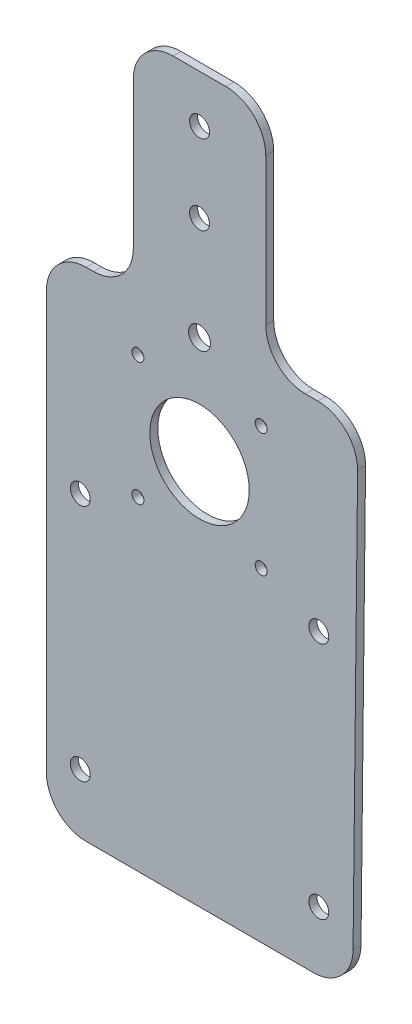
ISO-10303-21;
HEADER;
FILE_DESCRIPTION(('STEP AP214'),'2;1');
FILE_NAME('part.step','',(''),(''),'','','');
FILE_SCHEMA(('AUTOMOTIVE_DESIGN { 1 0 10303 214 1 1 1 1 }'));
ENDSEC;
DATA;
#1=APPLICATION_CONTEXT('core data for automotive mechanical design processes');
#2=APPLICATION_PROTOCOL_DEFINITION('international standard','automotive_design',2000,#1);
#3=PRODUCT_CONTEXT('',#1,'mechanical');
#4=PRODUCT('Part','Part','',(#3));
#5=PRODUCT_RELATED_PRODUCT_CATEGORY('part','',(#4));
#6=PRODUCT_DEFINITION_FORMATION('','',#4);
#7=PRODUCT_DEFINITION_CONTEXT('part definition',#1,'design');
#8=PRODUCT_DEFINITION('design','',#6,#7);
#9=PRODUCT_DEFINITION_SHAPE('','',#8);
#10=(LENGTH_UNIT() NAMED_UNIT(*) SI_UNIT(.MILLI.,.METRE.));
#11=(NAMED_UNIT(*) PLANE_ANGLE_UNIT() SI_UNIT($,.RADIAN.));
#12=(NAMED_UNIT(*) SI_UNIT($,.STERADIAN.) SOLID_ANGLE_UNIT());
#13=UNCERTAINTY_MEASURE_WITH_UNIT(LENGTH_MEASURE(1.E-05),#10,'distance_accuracy_value','');
#14=(GEOMETRIC_REPRESENTATION_CONTEXT(3) GLOBAL_UNCERTAINTY_ASSIGNED_CONTEXT((#13)) GLOBAL_UNIT_ASSIGNED_CONTEXT((#10,
#11,#12)) REPRESENTATION_CONTEXT('',''));
#15=CARTESIAN_POINT('',(0.,0.,0.));
#16=DIRECTION('',(0.,0.,1.));
#17=DIRECTION('',(1.,0.,0.));
#18=AXIS2_PLACEMENT_3D('',#15,#16,#17);
#19=CARTESIAN_POINT('',(0.,0.,2.));
#20=DIRECTION('',(0.,0.,-1.));
#21=DIRECTION('',(-1.,0.,0.));
#22=AXIS2_PLACEMENT_3D('',#19,#20,#21);
#23=PLANE('',#22);
#24=CARTESIAN_POINT('',(58.5,97.,2.));
#25=DIRECTION('',(0.,0.,1.));
#26=DIRECTION('',(1.,0.,0.));
#27=AXIS2_PLACEMENT_3D('',#24,#25,#26);
#28=CIRCLE('',#27,12.5);
#29=CARTESIAN_POINT('',(71.,97.,2.));
#30=VERTEX_POINT('',#29);
#31=EDGE_CURVE('E297',#30,#30,#28,.T.);
#32=ORIENTED_EDGE('',*,*,#31,.F.);
#33=EDGE_LOOP('',(#32));
#34=FACE_BOUND('',#33,.T.);
#35=CARTESIAN_POINT('',(43.,112.5,2.));
#36=DIRECTION('',(0.,0.,1.));
#37=DIRECTION('',(1.,0.,0.));
#38=AXIS2_PLACEMENT_3D('',#35,#36,#37);
#39=CIRCLE('',#38,1.5);
#40=CARTESIAN_POINT('',(44.5,112.5,2.));
#41=VERTEX_POINT('',#40);
#42=EDGE_CURVE('E294',#41,#41,#39,.T.);
#43=ORIENTED_EDGE('',*,*,#42,.F.);
#44=EDGE_LOOP('',(#43));
#45=FACE_BOUND('',#44,.T.);
#46=CARTESIAN_POINT('',(74.,112.5,2.));
#47=DIRECTION('',(0.,0.,1.));
#48=DIRECTION('',(1.,0.,0.));
#49=AXIS2_PLACEMENT_3D('',#46,#47,#48);
#50=CIRCLE('',#49,1.5);
#51=CARTESIAN_POINT('',(75.5,112.5,2.));
#52=VERTEX_POINT('',#51);
#53=EDGE_CURVE('E298',#52,#52,#50,.T.);
#54=ORIENTED_EDGE('',*,*,#53,.F.);
#55=EDGE_LOOP('',(#54));
#56=FACE_BOUND('',#55,.T.);
#57=CARTESIAN_POINT('',(74.,81.5,2.));
#58=DIRECTION('',(0.,0.,1.));
#59=DIRECTION('',(1.,0.,0.));
#60=AXIS2_PLACEMENT_3D('',#57,#58,#59);
#61=CIRCLE('',#60,1.5);
#62=CARTESIAN_POINT('',(75.5,81.5,2.));
#63=VERTEX_POINT('',#62);
#64=EDGE_CURVE('E301',#63,#63,#61,.T.);
#65=ORIENTED_EDGE('',*,*,#64,.F.);
#66=EDGE_LOOP('',(#65));
#67=FACE_BOUND('',#66,.T.);
#68=CARTESIAN_POINT('',(43.,81.5,2.));
#69=DIRECTION('',(0.,0.,1.));
#70=DIRECTION('',(1.,0.,0.));
#71=AXIS2_PLACEMENT_3D('',#68,#69,#70);
#72=CIRCLE('',#71,1.5);
#73=CARTESIAN_POINT('',(44.5,81.5,2.));
#74=VERTEX_POINT('',#73);
#75=EDGE_CURVE('E304',#74,#74,#72,.T.);
#76=ORIENTED_EDGE('',*,*,#75,.F.);
#77=EDGE_LOOP('',(#76));
#78=FACE_BOUND('',#77,.T.);
#79=CARTESIAN_POINT('',(28.5,75.,2.));
#80=DIRECTION('',(0.,0.,1.));
#81=DIRECTION('',(1.,0.,0.));
#82=AXIS2_PLACEMENT_3D('',#79,#80,#81);
#83=CIRCLE('',#82,2.5);
#84=CARTESIAN_POINT('',(31.,75.,2.));
#85=VERTEX_POINT('',#84);
#86=EDGE_CURVE('E307',#85,#85,#83,.T.);
#87=ORIENTED_EDGE('',*,*,#86,.F.);
#88=EDGE_LOOP('',(#87));
#89=FACE_BOUND('',#88,.T.);
#90=CARTESIAN_POINT('',(88.5,75.,2.));
#91=DIRECTION('',(0.,0.,1.));
#92=DIRECTION('',(1.,0.,0.));
#93=AXIS2_PLACEMENT_3D('',#90,#91,#92);
#94=CIRCLE('',#93,2.5);
#95=CARTESIAN_POINT('',(91.,75.,2.));
#96=VERTEX_POINT('',#95);
#97=EDGE_CURVE('E310',#96,#96,#94,.T.);
#98=ORIENTED_EDGE('',*,*,#97,.F.);
#99=EDGE_LOOP('',(#98));
#100=FACE_BOUND('',#99,.T.);
#101=CARTESIAN_POINT('',(88.5,15.,2.));
#102=DIRECTION('',(0.,0.,1.));
#103=DIRECTION('',(1.,0.,0.));
#104=AXIS2_PLACEMENT_3D('',#101,#102,#103);
#105=CIRCLE('',#104,2.50000000000001);
#106=CARTESIAN_POINT('',(91.,15.,2.));
#107=VERTEX_POINT('',#106);
#108=EDGE_CURVE('E313',#107,#107,#105,.T.);
#109=ORIENTED_EDGE('',*,*,#108,.F.);
#110=EDGE_LOOP('',(#109));
#111=FACE_BOUND('',#110,.T.);
#112=CARTESIAN_POINT('',(28.5,15.,2.));
#113=DIRECTION('',(0.,0.,1.));
#114=DIRECTION('',(1.,0.,0.));
#115=AXIS2_PLACEMENT_3D('',#112,#113,#114);
#116=CIRCLE('',#115,2.5);
#117=CARTESIAN_POINT('',(31.,15.,2.));
#118=VERTEX_POINT('',#117);
#119=EDGE_CURVE('E316',#118,#118,#116,.T.);
#120=ORIENTED_EDGE('',*,*,#119,.F.);
#121=EDGE_LOOP('',(#120));
#122=FACE_BOUND('',#121,.T.);
#123=CARTESIAN_POINT('',(58.5,170.,2.));
#124=DIRECTION('',(0.,0.,1.));
#125=DIRECTION('',(1.,0.,0.));
#126=AXIS2_PLACEMENT_3D('',#123,#124,#125);
#127=CIRCLE('',#126,2.5);
#128=CARTESIAN_POINT('',(61.,170.,2.));
#129=VERTEX_POINT('',#128);
#130=EDGE_CURVE('E319',#129,#129,#127,.T.);
#131=ORIENTED_EDGE('',*,*,#130,.F.);
#132=EDGE_LOOP('',(#131));
#133=FACE_BOUND('',#132,.T.);
#134=CARTESIAN_POINT('',(58.5,150.,2.));
#135=DIRECTION('',(0.,0.,1.));
#136=DIRECTION('',(1.,0.,0.));
#137=AXIS2_PLACEMENT_3D('',#134,#135,#136);
#138=CIRCLE('',#137,2.5);
#139=CARTESIAN_POINT('',(61.,150.,2.));
#140=VERTEX_POINT('',#139);
#141=EDGE_CURVE('E322',#140,#140,#138,.T.);
#142=ORIENTED_EDGE('',*,*,#141,.F.);
#143=EDGE_LOOP('',(#142));
#144=FACE_BOUND('',#143,.T.);
#145=CARTESIAN_POINT('',(58.5,124.,2.));
#146=DIRECTION('',(0.,0.,1.));
#147=DIRECTION('',(1.,0.,0.));
#148=AXIS2_PLACEMENT_3D('',#145,#146,#147);
#149=CIRCLE('',#148,2.75);
#150=CARTESIAN_POINT('',(61.25,124.,2.));
#151=VERTEX_POINT('',#150);
#152=EDGE_CURVE('E293',#151,#151,#149,.T.);
#153=ORIENTED_EDGE('',*,*,#152,.F.);
#154=EDGE_LOOP('',(#153));
#155=FACE_BOUND('',#154,.T.);
#156=DIRECTION('',(-1.,0.,0.));
#157=VECTOR('',#156,1.);
#158=CARTESIAN_POINT('',(0.,182.,2.));
#159=LINE('',#158,#157);
#160=CARTESIAN_POINT('',(65.1539424673848,182.,2.));
#161=VERTEX_POINT('',#160);
#162=CARTESIAN_POINT('',(51.8460575326152,182.,2.));
#163=VERTEX_POINT('',#162);
#164=EDGE_CURVE('E252',#161,#163,#159,.T.);
#165=ORIENTED_EDGE('',*,*,#164,.T.);
#166=CARTESIAN_POINT('',(51.8460575326152,172.,2.));
#167=DIRECTION('',(0.,0.,-1.));
#168=DIRECTION('',(-1.,0.,0.));
#169=AXIS2_PLACEMENT_3D('',#166,#167,#168);
#170=CIRCLE('',#169,10.);
#171=CARTESIAN_POINT('',(41.8460575326152,172.,2.));
#172=VERTEX_POINT('',#171);
#173=EDGE_CURVE('E47',#163,#172,#170,.F.);
#174=ORIENTED_EDGE('',*,*,#173,.T.);
#175=DIRECTION('',(0.,-1.,0.));
#176=VECTOR('',#175,1.);
#177=CARTESIAN_POINT('',(41.8460575326152,0.,2.));
#178=LINE('',#177,#176);
#179=CARTESIAN_POINT('',(41.8460575326152,135.055763262131,2.));
#180=VERTEX_POINT('',#179);
#181=EDGE_CURVE('E165',#172,#180,#178,.T.);
#182=ORIENTED_EDGE('',*,*,#181,.T.);
#183=CARTESIAN_POINT('',(31.8460575326152,135.055763262131,2.));
#184=DIRECTION('',(0.,0.,-1.));
#185=DIRECTION('',(-1.,0.,0.));
#186=AXIS2_PLACEMENT_3D('',#183,#184,#185);
#187=CIRCLE('',#186,10.);
#188=CARTESIAN_POINT('',(31.8460575326152,125.055763262131,2.));
#189=VERTEX_POINT('',#188);
#190=EDGE_CURVE('E230',#180,#189,#187,.T.);
#191=ORIENTED_EDGE('',*,*,#190,.T.);
#192=DIRECTION('',(-1.,0.,0.));
#193=VECTOR('',#192,1.);
#194=CARTESIAN_POINT('',(0.,125.055763262131,2.));
#195=LINE('',#194,#193);
#196=CARTESIAN_POINT('',(30.,125.055763262131,2.));
#197=VERTEX_POINT('',#196);
#198=EDGE_CURVE('E276',#189,#197,#195,.T.);
#199=ORIENTED_EDGE('',*,*,#198,.T.);
#200=CARTESIAN_POINT('',(30.,115.055763262131,2.));
#201=DIRECTION('',(0.,0.,-1.));
#202=DIRECTION('',(-1.,0.,0.));
#203=AXIS2_PLACEMENT_3D('',#200,#201,#202);
#204=CIRCLE('',#203,10.);
#205=CARTESIAN_POINT('',(20.,115.055763262131,2.));
#206=VERTEX_POINT('',#205);
#207=EDGE_CURVE('E209',#197,#206,#204,.F.);
#208=ORIENTED_EDGE('',*,*,#207,.T.);
#209=DIRECTION('',(0.,-1.,0.));
#210=VECTOR('',#209,1.);
#211=CARTESIAN_POINT('',(20.,0.,2.));
#212=LINE('',#211,#210);
#213=CARTESIAN_POINT('',(20.,10.,2.));
#214=VERTEX_POINT('',#213);
#215=EDGE_CURVE('E291',#206,#214,#212,.T.);
#216=ORIENTED_EDGE('',*,*,#215,.T.);
#217=CARTESIAN_POINT('',(30.,10.,2.));
#218=DIRECTION('',(0.,0.,-1.));
#219=DIRECTION('',(-1.,0.,0.));
#220=AXIS2_PLACEMENT_3D('',#217,#218,#219);
#221=CIRCLE('',#220,10.);
#222=CARTESIAN_POINT('',(30.,0.,2.));
#223=VERTEX_POINT('',#222);
#224=EDGE_CURVE('E181',#214,#223,#221,.F.);
#225=ORIENTED_EDGE('',*,*,#224,.T.);
#226=DIRECTION('',(1.,0.,0.));
#227=VECTOR('',#226,1.);
#228=CARTESIAN_POINT('',(0.,0.,2.));
#229=LINE('',#228,#227);
#230=CARTESIAN_POINT('',(87.1084971040274,0.,2.));
#231=VERTEX_POINT('',#230);
#232=EDGE_CURVE('E182',#223,#231,#229,.T.);
#233=ORIENTED_EDGE('',*,*,#232,.T.);
#234=CARTESIAN_POINT('',(87.1084971040274,10.,2.));
#235=DIRECTION('',(0.,0.,-1.));
#236=DIRECTION('',(-1.,0.,0.));
#237=AXIS2_PLACEMENT_3D('',#234,#235,#236);
#238=CIRCLE('',#237,10.);
#239=CARTESIAN_POINT('',(97.1079021023733,9.89091434991413,2.));
#240=VERTEX_POINT('',#239);
#241=EDGE_CURVE('E177',#231,#240,#238,.F.);
#242=ORIENTED_EDGE('',*,*,#241,.T.);
#243=DIRECTION('',(0.0109085650085876,0.999940499834592,0.));
#244=VECTOR('',#243,1.);
#245=CARTESIAN_POINT('',(96.988457311317,-1.05806784687503,2.));
#246=LINE('',#245,#244);
#247=CARTESIAN_POINT('',(98.2539779171456,114.946677612045,2.));
#248=VERTEX_POINT('',#247);
#249=EDGE_CURVE('E287',#240,#248,#246,.T.);
#250=ORIENTED_EDGE('',*,*,#249,.T.);
#251=CARTESIAN_POINT('',(88.2545729187997,115.055763262131,2.));
#252=DIRECTION('',(0.,0.,-1.));
#253=DIRECTION('',(-1.,0.,0.));
#254=AXIS2_PLACEMENT_3D('',#251,#252,#253);
#255=CIRCLE('',#254,10.);
#256=CARTESIAN_POINT('',(88.2545729187997,125.055763262131,2.));
#257=VERTEX_POINT('',#256);
#258=EDGE_CURVE('E207',#248,#257,#255,.F.);
#259=ORIENTED_EDGE('',*,*,#258,.T.);
#260=DIRECTION('',(1.,0.,0.));
#261=VECTOR('',#260,1.);
#262=CARTESIAN_POINT('',(0.,125.055763262131,2.));
#263=LINE('',#262,#261);
#264=CARTESIAN_POINT('',(85.1539424673848,125.055763262131,2.));
#265=VERTEX_POINT('',#264);
#266=EDGE_CURVE('E282',#265,#257,#263,.T.);
#267=ORIENTED_EDGE('',*,*,#266,.F.);
#268=CARTESIAN_POINT('',(85.1539424673848,135.055763262131,2.));
#269=DIRECTION('',(0.,0.,-1.));
#270=DIRECTION('',(-1.,0.,0.));
#271=AXIS2_PLACEMENT_3D('',#268,#269,#270);
#272=CIRCLE('',#271,10.);
#273=CARTESIAN_POINT('',(75.1539424673848,135.055763262131,2.));
#274=VERTEX_POINT('',#273);
#275=EDGE_CURVE('E234',#265,#274,#272,.T.);
#276=ORIENTED_EDGE('',*,*,#275,.T.);
#277=DIRECTION('',(0.,-1.,0.));
#278=VECTOR('',#277,1.);
#279=CARTESIAN_POINT('',(75.1539424673848,0.,2.));
#280=LINE('',#279,#278);
#281=CARTESIAN_POINT('',(75.1539424673848,172.,2.));
#282=VERTEX_POINT('',#281);
#283=EDGE_CURVE('E259',#282,#274,#280,.T.);
#284=ORIENTED_EDGE('',*,*,#283,.F.);
#285=CARTESIAN_POINT('',(65.1539424673848,172.,2.));
#286=DIRECTION('',(0.,0.,-1.));
#287=DIRECTION('',(-1.,0.,0.));
#288=AXIS2_PLACEMENT_3D('',#285,#286,#287);
#289=CIRCLE('',#288,10.);
#290=EDGE_CURVE('E248',#282,#161,#289,.F.);
#291=ORIENTED_EDGE('',*,*,#290,.T.);
#292=EDGE_LOOP('',(#165,#174,#182,#191,#199,#208,#216,#225,#233,#242,#250,#259,#267,#276,#284,#291));
#293=FACE_BOUND('',#292,.T.);
#294=ADVANCED_FACE('F39',(#34,#45,#56,#67,#78,#89,#100,#111,#122,#133,#144,#155,#293),#23,.F.);
#295=CARTESIAN_POINT('',(0.,0.,0.));
#296=DIRECTION('',(0.,0.,-1.));
#297=DIRECTION('',(-1.,0.,0.));
#298=AXIS2_PLACEMENT_3D('',#295,#296,#297);
#299=PLANE('',#298);
#300=DIRECTION('',(0.,-1.,0.));
#301=VECTOR('',#300,1.);
#302=CARTESIAN_POINT('',(41.8460575326152,0.,0.));
#303=LINE('',#302,#301);
#304=CARTESIAN_POINT('',(41.8460575326152,172.,0.));
#305=VERTEX_POINT('',#304);
#306=CARTESIAN_POINT('',(41.8460575326152,135.055763262131,0.));
#307=VERTEX_POINT('',#306);
#308=EDGE_CURVE('E264',#305,#307,#303,.T.);
#309=ORIENTED_EDGE('',*,*,#308,.F.);
#310=CARTESIAN_POINT('',(51.8460575326152,172.,0.));
#311=DIRECTION('',(0.,0.,-1.));
#312=DIRECTION('',(-1.,0.,0.));
#313=AXIS2_PLACEMENT_3D('',#310,#311,#312);
#314=CIRCLE('',#313,10.);
#315=CARTESIAN_POINT('',(51.8460575326152,182.,0.));
#316=VERTEX_POINT('',#315);
#317=EDGE_CURVE('E242',#305,#316,#314,.T.);
#318=ORIENTED_EDGE('',*,*,#317,.T.);
#319=DIRECTION('',(-1.,0.,0.));
#320=VECTOR('',#319,1.);
#321=CARTESIAN_POINT('',(0.,182.,0.));
#322=LINE('',#321,#320);
#323=CARTESIAN_POINT('',(65.1539424673848,182.,0.));
#324=VERTEX_POINT('',#323);
#325=EDGE_CURVE('E263',#324,#316,#322,.T.);
#326=ORIENTED_EDGE('',*,*,#325,.F.);
#327=CARTESIAN_POINT('',(65.1539424673848,172.,0.));
#328=DIRECTION('',(0.,0.,-1.));
#329=DIRECTION('',(-1.,0.,0.));
#330=AXIS2_PLACEMENT_3D('',#327,#328,#329);
#331=CIRCLE('',#330,10.);
#332=CARTESIAN_POINT('',(75.1539424673848,172.,0.));
#333=VERTEX_POINT('',#332);
#334=EDGE_CURVE('E240',#324,#333,#331,.T.);
#335=ORIENTED_EDGE('',*,*,#334,.T.);
#336=DIRECTION('',(0.,-1.,0.));
#337=VECTOR('',#336,1.);
#338=CARTESIAN_POINT('',(75.1539424673848,0.,0.));
#339=LINE('',#338,#337);
#340=CARTESIAN_POINT('',(75.1539424673848,135.055763262131,0.));
#341=VERTEX_POINT('',#340);
#342=EDGE_CURVE('E273',#333,#341,#339,.T.);
#343=ORIENTED_EDGE('',*,*,#342,.T.);
#344=CARTESIAN_POINT('',(85.1539424673848,135.055763262131,0.));
#345=DIRECTION('',(0.,0.,-1.));
#346=DIRECTION('',(-1.,0.,0.));
#347=AXIS2_PLACEMENT_3D('',#344,#345,#346);
#348=CIRCLE('',#347,10.);
#349=CARTESIAN_POINT('',(85.1539424673848,125.055763262131,0.));
#350=VERTEX_POINT('',#349);
#351=EDGE_CURVE('E232',#341,#350,#348,.F.);
#352=ORIENTED_EDGE('',*,*,#351,.T.);
#353=DIRECTION('',(1.,0.,0.));
#354=VECTOR('',#353,1.);
#355=CARTESIAN_POINT('',(0.,125.055763262131,0.));
#356=LINE('',#355,#354);
#357=CARTESIAN_POINT('',(88.2545729187997,125.055763262131,0.));
#358=VERTEX_POINT('',#357);
#359=EDGE_CURVE('E270',#350,#358,#356,.T.);
#360=ORIENTED_EDGE('',*,*,#359,.T.);
#361=CARTESIAN_POINT('',(88.2545729187997,115.055763262131,0.));
#362=DIRECTION('',(0.,0.,-1.));
#363=DIRECTION('',(-1.,0.,0.));
#364=AXIS2_PLACEMENT_3D('',#361,#362,#363);
#365=CIRCLE('',#364,10.);
#366=CARTESIAN_POINT('',(98.2539779171456,114.946677612045,0.));
#367=VERTEX_POINT('',#366);
#368=EDGE_CURVE('E200',#358,#367,#365,.T.);
#369=ORIENTED_EDGE('',*,*,#368,.T.);
#370=DIRECTION('',(0.0109085650085876,0.999940499834592,0.));
#371=VECTOR('',#370,1.);
#372=CARTESIAN_POINT('',(97.,0.,0.));
#373=LINE('',#372,#371);
#374=CARTESIAN_POINT('',(97.1079021023734,9.89091434991412,0.));
#375=VERTEX_POINT('',#374);
#376=EDGE_CURVE('E164',#375,#367,#373,.T.);
#377=ORIENTED_EDGE('',*,*,#376,.F.);
#378=CARTESIAN_POINT('',(87.1084971040274,10.,0.));
#379=DIRECTION('',(0.,0.,-1.));
#380=DIRECTION('',(-1.,0.,0.));
#381=AXIS2_PLACEMENT_3D('',#378,#379,#380);
#382=CIRCLE('',#381,10.);
#383=CARTESIAN_POINT('',(87.1084971040274,0.,0.));
#384=VERTEX_POINT('',#383);
#385=EDGE_CURVE('E178',#375,#384,#382,.T.);
#386=ORIENTED_EDGE('',*,*,#385,.T.);
#387=DIRECTION('',(1.,0.,0.));
#388=VECTOR('',#387,1.);
#389=CARTESIAN_POINT('',(0.,0.,0.));
#390=LINE('',#389,#388);
#391=CARTESIAN_POINT('',(30.,0.,0.));
#392=VERTEX_POINT('',#391);
#393=EDGE_CURVE('E173',#392,#384,#390,.T.);
#394=ORIENTED_EDGE('',*,*,#393,.F.);
#395=CARTESIAN_POINT('',(30.,10.,0.));
#396=DIRECTION('',(0.,0.,-1.));
#397=DIRECTION('',(-1.,0.,0.));
#398=AXIS2_PLACEMENT_3D('',#395,#396,#397);
#399=CIRCLE('',#398,10.);
#400=CARTESIAN_POINT('',(20.,10.,0.));
#401=VERTEX_POINT('',#400);
#402=EDGE_CURVE('E168',#392,#401,#399,.T.);
#403=ORIENTED_EDGE('',*,*,#402,.T.);
#404=DIRECTION('',(0.,-1.,0.));
#405=VECTOR('',#404,1.);
#406=CARTESIAN_POINT('',(20.,0.,0.));
#407=LINE('',#406,#405);
#408=CARTESIAN_POINT('',(20.,115.055763262131,0.));
#409=VERTEX_POINT('',#408);
#410=EDGE_CURVE('E154',#409,#401,#407,.T.);
#411=ORIENTED_EDGE('',*,*,#410,.F.);
#412=CARTESIAN_POINT('',(30.,115.055763262131,0.));
#413=DIRECTION('',(0.,0.,-1.));
#414=DIRECTION('',(-1.,0.,0.));
#415=AXIS2_PLACEMENT_3D('',#412,#413,#414);
#416=CIRCLE('',#415,10.);
#417=CARTESIAN_POINT('',(30.,125.055763262131,0.));
#418=VERTEX_POINT('',#417);
#419=EDGE_CURVE('E202',#409,#418,#416,.T.);
#420=ORIENTED_EDGE('',*,*,#419,.T.);
#421=DIRECTION('',(-1.,0.,0.));
#422=VECTOR('',#421,1.);
#423=CARTESIAN_POINT('',(0.,125.055763262131,0.));
#424=LINE('',#423,#422);
#425=CARTESIAN_POINT('',(31.8460575326152,125.055763262131,0.));
#426=VERTEX_POINT('',#425);
#427=EDGE_CURVE('E274',#426,#418,#424,.T.);
#428=ORIENTED_EDGE('',*,*,#427,.F.);
#429=CARTESIAN_POINT('',(31.8460575326152,135.055763262131,0.));
#430=DIRECTION('',(0.,0.,-1.));
#431=DIRECTION('',(-1.,0.,0.));
#432=AXIS2_PLACEMENT_3D('',#429,#430,#431);
#433=CIRCLE('',#432,10.);
#434=EDGE_CURVE('E227',#426,#307,#433,.F.);
#435=ORIENTED_EDGE('',*,*,#434,.T.);
#436=EDGE_LOOP('',(#309,#318,#326,#335,#343,#352,#360,#369,#377,#386,#394,#403,#411,#420,#428,#435));
#437=FACE_BOUND('',#436,.T.);
#438=CARTESIAN_POINT('',(58.5,124.,0.));
#439=DIRECTION('',(0.,0.,-1.));
#440=DIRECTION('',(-1.,0.,0.));
#441=AXIS2_PLACEMENT_3D('',#438,#439,#440);
#442=CIRCLE('',#441,2.75);
#443=CARTESIAN_POINT('',(55.75,124.,0.));
#444=VERTEX_POINT('',#443);
#445=EDGE_CURVE('E188',#444,#444,#442,.T.);
#446=ORIENTED_EDGE('',*,*,#445,.F.);
#447=EDGE_LOOP('',(#446));
#448=FACE_BOUND('',#447,.T.);
#449=CARTESIAN_POINT('',(58.5,150.,0.));
#450=DIRECTION('',(0.,0.,-1.));
#451=DIRECTION('',(-1.,0.,0.));
#452=AXIS2_PLACEMENT_3D('',#449,#450,#451);
#453=CIRCLE('',#452,2.5);
#454=CARTESIAN_POINT('',(56.,150.,0.));
#455=VERTEX_POINT('',#454);
#456=EDGE_CURVE('E359',#455,#455,#453,.T.);
#457=ORIENTED_EDGE('',*,*,#456,.F.);
#458=EDGE_LOOP('',(#457));
#459=FACE_BOUND('',#458,.T.);
#460=CARTESIAN_POINT('',(58.5,170.,0.));
#461=DIRECTION('',(0.,0.,-1.));
#462=DIRECTION('',(-1.,0.,0.));
#463=AXIS2_PLACEMENT_3D('',#460,#461,#462);
#464=CIRCLE('',#463,2.5);
#465=CARTESIAN_POINT('',(56.,170.,0.));
#466=VERTEX_POINT('',#465);
#467=EDGE_CURVE('E357',#466,#466,#464,.T.);
#468=ORIENTED_EDGE('',*,*,#467,.F.);
#469=EDGE_LOOP('',(#468));
#470=FACE_BOUND('',#469,.T.);
#471=CARTESIAN_POINT('',(28.5,15.,0.));
#472=DIRECTION('',(0.,0.,-1.));
#473=DIRECTION('',(-1.,0.,0.));
#474=AXIS2_PLACEMENT_3D('',#471,#472,#473);
#475=CIRCLE('',#474,2.5);
#476=CARTESIAN_POINT('',(26.,15.,0.));
#477=VERTEX_POINT('',#476);
#478=EDGE_CURVE('E354',#477,#477,#475,.T.);
#479=ORIENTED_EDGE('',*,*,#478,.F.);
#480=EDGE_LOOP('',(#479));
#481=FACE_BOUND('',#480,.T.);
#482=CARTESIAN_POINT('',(88.5,15.,0.));
#483=DIRECTION('',(0.,0.,-1.));
#484=DIRECTION('',(-1.,0.,0.));
#485=AXIS2_PLACEMENT_3D('',#482,#483,#484);
#486=CIRCLE('',#485,2.50000000000001);
#487=CARTESIAN_POINT('',(86.,15.,0.));
#488=VERTEX_POINT('',#487);
#489=EDGE_CURVE('E351',#488,#488,#486,.T.);
#490=ORIENTED_EDGE('',*,*,#489,.F.);
#491=EDGE_LOOP('',(#490));
#492=FACE_BOUND('',#491,.T.);
#493=CARTESIAN_POINT('',(88.5,75.,0.));
#494=DIRECTION('',(0.,0.,-1.));
#495=DIRECTION('',(-1.,0.,0.));
#496=AXIS2_PLACEMENT_3D('',#493,#494,#495);
#497=CIRCLE('',#496,2.5);
#498=CARTESIAN_POINT('',(86.,75.,0.));
#499=VERTEX_POINT('',#498);
#500=EDGE_CURVE('E348',#499,#499,#497,.T.);
#501=ORIENTED_EDGE('',*,*,#500,.F.);
#502=EDGE_LOOP('',(#501));
#503=FACE_BOUND('',#502,.T.);
#504=CARTESIAN_POINT('',(28.5,75.,0.));
#505=DIRECTION('',(0.,0.,-1.));
#506=DIRECTION('',(-1.,0.,0.));
#507=AXIS2_PLACEMENT_3D('',#504,#505,#506);
#508=CIRCLE('',#507,2.5);
#509=CARTESIAN_POINT('',(26.,75.,0.));
#510=VERTEX_POINT('',#509);
#511=EDGE_CURVE('E345',#510,#510,#508,.T.);
#512=ORIENTED_EDGE('',*,*,#511,.F.);
#513=EDGE_LOOP('',(#512));
#514=FACE_BOUND('',#513,.T.);
#515=CARTESIAN_POINT('',(43.,81.5,0.));
#516=DIRECTION('',(0.,0.,-1.));
#517=DIRECTION('',(-1.,0.,0.));
#518=AXIS2_PLACEMENT_3D('',#515,#516,#517);
#519=CIRCLE('',#518,1.5);
#520=CARTESIAN_POINT('',(41.5,81.5,0.));
#521=VERTEX_POINT('',#520);
#522=EDGE_CURVE('E342',#521,#521,#519,.T.);
#523=ORIENTED_EDGE('',*,*,#522,.F.);
#524=EDGE_LOOP('',(#523));
#525=FACE_BOUND('',#524,.T.);
#526=CARTESIAN_POINT('',(74.,81.5,0.));
#527=DIRECTION('',(0.,0.,-1.));
#528=DIRECTION('',(-1.,0.,0.));
#529=AXIS2_PLACEMENT_3D('',#526,#527,#528);
#530=CIRCLE('',#529,1.5);
#531=CARTESIAN_POINT('',(72.5,81.5,0.));
#532=VERTEX_POINT('',#531);
#533=EDGE_CURVE('E339',#532,#532,#530,.T.);
#534=ORIENTED_EDGE('',*,*,#533,.F.);
#535=EDGE_LOOP('',(#534));
#536=FACE_BOUND('',#535,.T.);
#537=CARTESIAN_POINT('',(74.,112.5,0.));
#538=DIRECTION('',(0.,0.,-1.));
#539=DIRECTION('',(-1.,0.,0.));
#540=AXIS2_PLACEMENT_3D('',#537,#538,#539);
#541=CIRCLE('',#540,1.5);
#542=CARTESIAN_POINT('',(72.5,112.5,0.));
#543=VERTEX_POINT('',#542);
#544=EDGE_CURVE('E336',#543,#543,#541,.T.);
#545=ORIENTED_EDGE('',*,*,#544,.F.);
#546=EDGE_LOOP('',(#545));
#547=FACE_BOUND('',#546,.T.);
#548=CARTESIAN_POINT('',(43.,112.5,0.));
#549=DIRECTION('',(0.,0.,-1.));
#550=DIRECTION('',(-1.,0.,0.));
#551=AXIS2_PLACEMENT_3D('',#548,#549,#550);
#552=CIRCLE('',#551,1.5);
#553=CARTESIAN_POINT('',(41.5,112.5,0.));
#554=VERTEX_POINT('',#553);
#555=EDGE_CURVE('E333',#554,#554,#552,.T.);
#556=ORIENTED_EDGE('',*,*,#555,.F.);
#557=EDGE_LOOP('',(#556));
#558=FACE_BOUND('',#557,.T.);
#559=CARTESIAN_POINT('',(58.5,97.,0.));
#560=DIRECTION('',(0.,0.,-1.));
#561=DIRECTION('',(-1.,0.,0.));
#562=AXIS2_PLACEMENT_3D('',#559,#560,#561);
#563=CIRCLE('',#562,12.5);
#564=CARTESIAN_POINT('',(46.,97.,0.));
#565=VERTEX_POINT('',#564);
#566=EDGE_CURVE('E328',#565,#565,#563,.T.);
#567=ORIENTED_EDGE('',*,*,#566,.F.);
#568=EDGE_LOOP('',(#567));
#569=FACE_BOUND('',#568,.T.);
#570=ADVANCED_FACE('F170',(#437,#448,#459,#470,#481,#492,#503,#514,#525,#536,#547,#558,#569),
#299,.T.);
#571=CARTESIAN_POINT('',(97.,0.,10.));
#572=DIRECTION('',(-0.999940499834592,0.0109085650085876,0.));
#573=DIRECTION('',(-0.0109085650085876,-0.999940499834592,0.));
#574=AXIS2_PLACEMENT_3D('',#571,#572,#573);
#575=PLANE('',#574);
#576=ORIENTED_EDGE('',*,*,#376,.T.);
#577=DIRECTION('',(0.,0.,-1.));
#578=VECTOR('',#577,1.);
#579=CARTESIAN_POINT('',(98.2539779171456,114.946677612045,2.));
#580=LINE('',#579,#578);
#581=EDGE_CURVE('E225',#367,#248,#580,.F.);
#582=ORIENTED_EDGE('',*,*,#581,.T.);
#583=ORIENTED_EDGE('',*,*,#249,.F.);
#584=DIRECTION('',(0.,0.,1.));
#585=VECTOR('',#584,1.);
#586=CARTESIAN_POINT('',(97.1079021023734,9.89091434991413,10.));
#587=LINE('',#586,#585);
#588=EDGE_CURVE('E198',#240,#375,#587,.F.);
#589=ORIENTED_EDGE('',*,*,#588,.T.);
#590=EDGE_LOOP('',(#576,#582,#583,#589));
#591=FACE_BOUND('',#590,.T.);
#592=ADVANCED_FACE('F370',(#591),#575,.F.);
#593=CARTESIAN_POINT('',(0.,0.,2.));
#594=DIRECTION('',(0.,1.,0.));
#595=DIRECTION('',(0.,0.,1.));
#596=AXIS2_PLACEMENT_3D('',#593,#594,#595);
#597=PLANE('',#596);
#598=ORIENTED_EDGE('',*,*,#232,.F.);
#599=DIRECTION('',(0.,0.,-1.));
#600=VECTOR('',#599,1.);
#601=CARTESIAN_POINT('',(30.,0.,2.));
#602=LINE('',#601,#600);
#603=EDGE_CURVE('E196',#223,#392,#602,.T.);
#604=ORIENTED_EDGE('',*,*,#603,.T.);
#605=ORIENTED_EDGE('',*,*,#393,.T.);
#606=DIRECTION('',(0.,0.,1.));
#607=VECTOR('',#606,1.);
#608=CARTESIAN_POINT('',(87.1084971040274,0.,2.));
#609=LINE('',#608,#607);
#610=EDGE_CURVE('E193',#384,#231,#609,.T.);
#611=ORIENTED_EDGE('',*,*,#610,.T.);
#612=EDGE_LOOP('',(#598,#604,#605,#611));
#613=FACE_BOUND('',#612,.T.);
#614=ADVANCED_FACE('F397',(#613),#597,.F.);
#615=CARTESIAN_POINT('',(58.5,97.,-28.));
#616=DIRECTION('',(0.,0.,1.));
#617=DIRECTION('',(1.,0.,0.));
#618=AXIS2_PLACEMENT_3D('',#615,#616,#617);
#619=CYLINDRICAL_SURFACE('',#618,12.5);
#620=ORIENTED_EDGE('',*,*,#566,.T.);
#621=EDGE_LOOP('',(#620));
#622=FACE_BOUND('',#621,.T.);
#623=ORIENTED_EDGE('',*,*,#31,.T.);
#624=EDGE_LOOP('',(#623));
#625=FACE_BOUND('',#624,.T.);
#626=ADVANCED_FACE('F393',(#622,#625),#619,.F.);
#627=CARTESIAN_POINT('',(43.,112.5,-28.));
#628=DIRECTION('',(0.,0.,1.));
#629=DIRECTION('',(1.,0.,0.));
#630=AXIS2_PLACEMENT_3D('',#627,#628,#629);
#631=CYLINDRICAL_SURFACE('',#630,1.5);
#632=ORIENTED_EDGE('',*,*,#555,.T.);
#633=EDGE_LOOP('',(#632));
#634=FACE_BOUND('',#633,.T.);
#635=ORIENTED_EDGE('',*,*,#42,.T.);
#636=EDGE_LOOP('',(#635));
#637=FACE_BOUND('',#636,.T.);
#638=ADVANCED_FACE('F396',(#634,#637),#631,.F.);
#639=CARTESIAN_POINT('',(74.,112.5,-28.));
#640=DIRECTION('',(0.,0.,1.));
#641=DIRECTION('',(1.,0.,0.));
#642=AXIS2_PLACEMENT_3D('',#639,#640,#641);
#643=CYLINDRICAL_SURFACE('',#642,1.5);
#644=ORIENTED_EDGE('',*,*,#544,.T.);
#645=EDGE_LOOP('',(#644));
#646=FACE_BOUND('',#645,.T.);
#647=ORIENTED_EDGE('',*,*,#53,.T.);
#648=EDGE_LOOP('',(#647));
#649=FACE_BOUND('',#648,.T.);
#650=ADVANCED_FACE('F490',(#646,#649),#643,.F.);
#651=CARTESIAN_POINT('',(74.,81.5,-28.));
#652=DIRECTION('',(0.,0.,1.));
#653=DIRECTION('',(1.,0.,0.));
#654=AXIS2_PLACEMENT_3D('',#651,#652,#653);
#655=CYLINDRICAL_SURFACE('',#654,1.5);
#656=ORIENTED_EDGE('',*,*,#533,.T.);
#657=EDGE_LOOP('',(#656));
#658=FACE_BOUND('',#657,.T.);
#659=ORIENTED_EDGE('',*,*,#64,.T.);
#660=EDGE_LOOP('',(#659));
#661=FACE_BOUND('',#660,.T.);
#662=ADVANCED_FACE('F494',(#658,#661),#655,.F.);
#663=CARTESIAN_POINT('',(43.,81.5,-28.));
#664=DIRECTION('',(0.,0.,1.));
#665=DIRECTION('',(1.,0.,0.));
#666=AXIS2_PLACEMENT_3D('',#663,#664,#665);
#667=CYLINDRICAL_SURFACE('',#666,1.5);
#668=ORIENTED_EDGE('',*,*,#522,.T.);
#669=EDGE_LOOP('',(#668));
#670=FACE_BOUND('',#669,.T.);
#671=ORIENTED_EDGE('',*,*,#75,.T.);
#672=EDGE_LOOP('',(#671));
#673=FACE_BOUND('',#672,.T.);
#674=ADVANCED_FACE('F498',(#670,#673),#667,.F.);
#675=CARTESIAN_POINT('',(28.5,75.,-28.));
#676=DIRECTION('',(0.,0.,1.));
#677=DIRECTION('',(1.,0.,0.));
#678=AXIS2_PLACEMENT_3D('',#675,#676,#677);
#679=CYLINDRICAL_SURFACE('',#678,2.5);
#680=ORIENTED_EDGE('',*,*,#511,.T.);
#681=EDGE_LOOP('',(#680));
#682=FACE_BOUND('',#681,.T.);
#683=ORIENTED_EDGE('',*,*,#86,.T.);
#684=EDGE_LOOP('',(#683));
#685=FACE_BOUND('',#684,.T.);
#686=ADVANCED_FACE('F502',(#682,#685),#679,.F.);
#687=CARTESIAN_POINT('',(88.5,75.,-28.));
#688=DIRECTION('',(0.,0.,1.));
#689=DIRECTION('',(1.,0.,0.));
#690=AXIS2_PLACEMENT_3D('',#687,#688,#689);
#691=CYLINDRICAL_SURFACE('',#690,2.5);
#692=ORIENTED_EDGE('',*,*,#500,.T.);
#693=EDGE_LOOP('',(#692));
#694=FACE_BOUND('',#693,.T.);
#695=ORIENTED_EDGE('',*,*,#97,.T.);
#696=EDGE_LOOP('',(#695));
#697=FACE_BOUND('',#696,.T.);
#698=ADVANCED_FACE('F506',(#694,#697),#691,.F.);
#699=CARTESIAN_POINT('',(88.5,15.,-28.));
#700=DIRECTION('',(0.,0.,1.));
#701=DIRECTION('',(1.,0.,0.));
#702=AXIS2_PLACEMENT_3D('',#699,#700,#701);
#703=CYLINDRICAL_SURFACE('',#702,2.50000000000001);
#704=ORIENTED_EDGE('',*,*,#489,.T.);
#705=EDGE_LOOP('',(#704));
#706=FACE_BOUND('',#705,.T.);
#707=ORIENTED_EDGE('',*,*,#108,.T.);
#708=EDGE_LOOP('',(#707));
#709=FACE_BOUND('',#708,.T.);
#710=ADVANCED_FACE('F510',(#706,#709),#703,.F.);
#711=CARTESIAN_POINT('',(28.5,15.,-28.));
#712=DIRECTION('',(0.,0.,1.));
#713=DIRECTION('',(1.,0.,0.));
#714=AXIS2_PLACEMENT_3D('',#711,#712,#713);
#715=CYLINDRICAL_SURFACE('',#714,2.5);
#716=ORIENTED_EDGE('',*,*,#478,.T.);
#717=EDGE_LOOP('',(#716));
#718=FACE_BOUND('',#717,.T.);
#719=ORIENTED_EDGE('',*,*,#119,.T.);
#720=EDGE_LOOP('',(#719));
#721=FACE_BOUND('',#720,.T.);
#722=ADVANCED_FACE('F514',(#718,#721),#715,.F.);
#723=CARTESIAN_POINT('',(58.5,170.,-28.));
#724=DIRECTION('',(0.,0.,1.));
#725=DIRECTION('',(1.,0.,0.));
#726=AXIS2_PLACEMENT_3D('',#723,#724,#725);
#727=CYLINDRICAL_SURFACE('',#726,2.5);
#728=ORIENTED_EDGE('',*,*,#467,.T.);
#729=EDGE_LOOP('',(#728));
#730=FACE_BOUND('',#729,.T.);
#731=ORIENTED_EDGE('',*,*,#130,.T.);
#732=EDGE_LOOP('',(#731));
#733=FACE_BOUND('',#732,.T.);
#734=ADVANCED_FACE('F434',(#730,#733),#727,.F.);
#735=CARTESIAN_POINT('',(58.5,150.,-28.));
#736=DIRECTION('',(0.,0.,1.));
#737=DIRECTION('',(1.,0.,0.));
#738=AXIS2_PLACEMENT_3D('',#735,#736,#737);
#739=CYLINDRICAL_SURFACE('',#738,2.5);
#740=ORIENTED_EDGE('',*,*,#456,.T.);
#741=EDGE_LOOP('',(#740));
#742=FACE_BOUND('',#741,.T.);
#743=ORIENTED_EDGE('',*,*,#141,.T.);
#744=EDGE_LOOP('',(#743));
#745=FACE_BOUND('',#744,.T.);
#746=ADVANCED_FACE('F426',(#742,#745),#739,.F.);
#747=CARTESIAN_POINT('',(58.5,124.,-28.));
#748=DIRECTION('',(0.,0.,1.));
#749=DIRECTION('',(1.,0.,0.));
#750=AXIS2_PLACEMENT_3D('',#747,#748,#749);
#751=CYLINDRICAL_SURFACE('',#750,2.75);
#752=ORIENTED_EDGE('',*,*,#445,.T.);
#753=EDGE_LOOP('',(#752));
#754=FACE_BOUND('',#753,.T.);
#755=ORIENTED_EDGE('',*,*,#152,.T.);
#756=EDGE_LOOP('',(#755));
#757=FACE_BOUND('',#756,.T.);
#758=ADVANCED_FACE('F366',(#754,#757),#751,.F.);
#759=CARTESIAN_POINT('',(20.,0.,10.));
#760=DIRECTION('',(1.,0.,0.));
#761=DIRECTION('',(0.,1.,0.));
#762=AXIS2_PLACEMENT_3D('',#759,#760,#761);
#763=PLANE('',#762);
#764=ORIENTED_EDGE('',*,*,#215,.F.);
#765=DIRECTION('',(0.,0.,-1.));
#766=VECTOR('',#765,1.);
#767=CARTESIAN_POINT('',(20.,115.055763262131,10.));
#768=LINE('',#767,#766);
#769=EDGE_CURVE('E162',#206,#409,#768,.T.);
#770=ORIENTED_EDGE('',*,*,#769,.T.);
#771=ORIENTED_EDGE('',*,*,#410,.T.);
#772=DIRECTION('',(0.,0.,-1.));
#773=VECTOR('',#772,1.);
#774=CARTESIAN_POINT('',(20.,10.,10.));
#775=LINE('',#774,#773);
#776=EDGE_CURVE('E159',#401,#214,#775,.F.);
#777=ORIENTED_EDGE('',*,*,#776,.T.);
#778=EDGE_LOOP('',(#764,#770,#771,#777));
#779=FACE_BOUND('',#778,.T.);
#780=ADVANCED_FACE('F157',(#779),#763,.F.);
#781=CARTESIAN_POINT('',(30.,10.,2.));
#782=DIRECTION('',(0.,0.,-1.));
#783=DIRECTION('',(-1.,0.,0.));
#784=AXIS2_PLACEMENT_3D('',#781,#782,#783);
#785=CYLINDRICAL_SURFACE('',#784,10.);
#786=ORIENTED_EDGE('',*,*,#224,.F.);
#787=ORIENTED_EDGE('',*,*,#776,.F.);
#788=ORIENTED_EDGE('',*,*,#402,.F.);
#789=ORIENTED_EDGE('',*,*,#603,.F.);
#790=EDGE_LOOP('',(#786,#787,#788,#789));
#791=FACE_BOUND('',#790,.T.);
#792=ADVANCED_FACE('F180',(#791),#785,.T.);
#793=CARTESIAN_POINT('',(87.1084971040274,10.,2.));
#794=DIRECTION('',(0.,0.,1.));
#795=DIRECTION('',(1.,0.,0.));
#796=AXIS2_PLACEMENT_3D('',#793,#794,#795);
#797=CYLINDRICAL_SURFACE('',#796,10.);
#798=ORIENTED_EDGE('',*,*,#385,.F.);
#799=ORIENTED_EDGE('',*,*,#588,.F.);
#800=ORIENTED_EDGE('',*,*,#241,.F.);
#801=ORIENTED_EDGE('',*,*,#610,.F.);
#802=EDGE_LOOP('',(#798,#799,#800,#801));
#803=FACE_BOUND('',#802,.T.);
#804=ADVANCED_FACE('F443',(#803),#797,.T.);
#805=CARTESIAN_POINT('',(41.8460575326152,0.,10.));
#806=DIRECTION('',(1.,0.,0.));
#807=DIRECTION('',(0.,0.,-1.));
#808=AXIS2_PLACEMENT_3D('',#805,#806,#807);
#809=PLANE('',#808);
#810=ORIENTED_EDGE('',*,*,#181,.F.);
#811=DIRECTION('',(0.,0.,-1.));
#812=VECTOR('',#811,1.);
#813=CARTESIAN_POINT('',(41.8460575326152,172.,10.));
#814=LINE('',#813,#812);
#815=EDGE_CURVE('E237',#172,#305,#814,.T.);
#816=ORIENTED_EDGE('',*,*,#815,.T.);
#817=ORIENTED_EDGE('',*,*,#308,.T.);
#818=DIRECTION('',(0.,0.,-1.));
#819=VECTOR('',#818,1.);
#820=CARTESIAN_POINT('',(41.8460575326152,135.055763262131,2.));
#821=LINE('',#820,#819);
#822=EDGE_CURVE('E211',#307,#180,#821,.F.);
#823=ORIENTED_EDGE('',*,*,#822,.T.);
#824=EDGE_LOOP('',(#810,#816,#817,#823));
#825=FACE_BOUND('',#824,.T.);
#826=ADVANCED_FACE('F256',(#825),#809,.F.);
#827=CARTESIAN_POINT('',(0.,125.055763262131,10.));
#828=DIRECTION('',(0.,-1.,0.));
#829=DIRECTION('',(0.,0.,-1.));
#830=AXIS2_PLACEMENT_3D('',#827,#828,#829);
#831=PLANE('',#830);
#832=ORIENTED_EDGE('',*,*,#198,.F.);
#833=DIRECTION('',(0.,0.,-1.));
#834=VECTOR('',#833,1.);
#835=CARTESIAN_POINT('',(31.8460575326152,125.055763262131,0.));
#836=LINE('',#835,#834);
#837=EDGE_CURVE('E216',#189,#426,#836,.T.);
#838=ORIENTED_EDGE('',*,*,#837,.T.);
#839=ORIENTED_EDGE('',*,*,#427,.T.);
#840=DIRECTION('',(0.,0.,-1.));
#841=VECTOR('',#840,1.);
#842=CARTESIAN_POINT('',(30.,125.055763262131,10.));
#843=LINE('',#842,#841);
#844=EDGE_CURVE('E214',#418,#197,#843,.F.);
#845=ORIENTED_EDGE('',*,*,#844,.T.);
#846=EDGE_LOOP('',(#832,#838,#839,#845));
#847=FACE_BOUND('',#846,.T.);
#848=ADVANCED_FACE('F476',(#847),#831,.F.);
#849=CARTESIAN_POINT('',(75.1539424673848,0.,10.));
#850=DIRECTION('',(1.,0.,0.));
#851=DIRECTION('',(0.,0.,-1.));
#852=AXIS2_PLACEMENT_3D('',#849,#850,#851);
#853=PLANE('',#852);
#854=ORIENTED_EDGE('',*,*,#342,.F.);
#855=DIRECTION('',(0.,0.,-1.));
#856=VECTOR('',#855,1.);
#857=CARTESIAN_POINT('',(75.1539424673848,172.,2.));
#858=LINE('',#857,#856);
#859=EDGE_CURVE('E11',#333,#282,#858,.F.);
#860=ORIENTED_EDGE('',*,*,#859,.T.);
#861=ORIENTED_EDGE('',*,*,#283,.T.);
#862=DIRECTION('',(0.,0.,-1.));
#863=VECTOR('',#862,1.);
#864=CARTESIAN_POINT('',(75.1539424673848,135.055763262131,0.));
#865=LINE('',#864,#863);
#866=EDGE_CURVE('E204',#274,#341,#865,.T.);
#867=ORIENTED_EDGE('',*,*,#866,.T.);
#868=EDGE_LOOP('',(#854,#860,#861,#867));
#869=FACE_BOUND('',#868,.T.);
#870=ADVANCED_FACE('F473',(#869),#853,.T.);
#871=CARTESIAN_POINT('',(0.,125.055763262131,10.));
#872=DIRECTION('',(0.,1.,0.));
#873=DIRECTION('',(0.,0.,1.));
#874=AXIS2_PLACEMENT_3D('',#871,#872,#873);
#875=PLANE('',#874);
#876=ORIENTED_EDGE('',*,*,#359,.F.);
#877=DIRECTION('',(0.,0.,-1.));
#878=VECTOR('',#877,1.);
#879=CARTESIAN_POINT('',(85.1539424673848,125.055763262131,2.));
#880=LINE('',#879,#878);
#881=EDGE_CURVE('E223',#350,#265,#880,.F.);
#882=ORIENTED_EDGE('',*,*,#881,.T.);
#883=ORIENTED_EDGE('',*,*,#266,.T.);
#884=DIRECTION('',(0.,0.,-1.));
#885=VECTOR('',#884,1.);
#886=CARTESIAN_POINT('',(88.2545729187997,125.055763262131,0.));
#887=LINE('',#886,#885);
#888=EDGE_CURVE('E220',#257,#358,#887,.T.);
#889=ORIENTED_EDGE('',*,*,#888,.T.);
#890=EDGE_LOOP('',(#876,#882,#883,#889));
#891=FACE_BOUND('',#890,.T.);
#892=ADVANCED_FACE('F451',(#891),#875,.T.);
#893=CARTESIAN_POINT('',(31.8460575326152,135.055763262131,10.));
#894=DIRECTION('',(0.,0.,1.));
#895=DIRECTION('',(1.,0.,0.));
#896=AXIS2_PLACEMENT_3D('',#893,#894,#895);
#897=CYLINDRICAL_SURFACE('',#896,10.);
#898=ORIENTED_EDGE('',*,*,#190,.F.);
#899=ORIENTED_EDGE('',*,*,#822,.F.);
#900=ORIENTED_EDGE('',*,*,#434,.F.);
#901=ORIENTED_EDGE('',*,*,#837,.F.);
#902=EDGE_LOOP('',(#898,#899,#900,#901));
#903=FACE_BOUND('',#902,.T.);
#904=ADVANCED_FACE('F447',(#903),#897,.F.);
#905=CARTESIAN_POINT('',(30.,115.055763262131,10.));
#906=DIRECTION('',(0.,0.,-1.));
#907=DIRECTION('',(-1.,0.,0.));
#908=AXIS2_PLACEMENT_3D('',#905,#906,#907);
#909=CYLINDRICAL_SURFACE('',#908,10.);
#910=ORIENTED_EDGE('',*,*,#207,.F.);
#911=ORIENTED_EDGE('',*,*,#844,.F.);
#912=ORIENTED_EDGE('',*,*,#419,.F.);
#913=ORIENTED_EDGE('',*,*,#769,.F.);
#914=EDGE_LOOP('',(#910,#911,#912,#913));
#915=FACE_BOUND('',#914,.T.);
#916=ADVANCED_FACE('F450',(#915),#909,.T.);
#917=CARTESIAN_POINT('',(85.1539424673848,135.055763262131,10.));
#918=DIRECTION('',(0.,0.,1.));
#919=DIRECTION('',(1.,0.,0.));
#920=AXIS2_PLACEMENT_3D('',#917,#918,#919);
#921=CYLINDRICAL_SURFACE('',#920,10.);
#922=ORIENTED_EDGE('',*,*,#275,.F.);
#923=ORIENTED_EDGE('',*,*,#881,.F.);
#924=ORIENTED_EDGE('',*,*,#351,.F.);
#925=ORIENTED_EDGE('',*,*,#866,.F.);
#926=EDGE_LOOP('',(#922,#923,#924,#925));
#927=FACE_BOUND('',#926,.T.);
#928=ADVANCED_FACE('F455',(#927),#921,.F.);
#929=CARTESIAN_POINT('',(88.2545729187997,115.055763262131,10.));
#930=DIRECTION('',(0.,0.,1.));
#931=DIRECTION('',(1.,0.,0.));
#932=AXIS2_PLACEMENT_3D('',#929,#930,#931);
#933=CYLINDRICAL_SURFACE('',#932,10.);
#934=ORIENTED_EDGE('',*,*,#258,.F.);
#935=ORIENTED_EDGE('',*,*,#581,.F.);
#936=ORIENTED_EDGE('',*,*,#368,.F.);
#937=ORIENTED_EDGE('',*,*,#888,.F.);
#938=EDGE_LOOP('',(#934,#935,#936,#937));
#939=FACE_BOUND('',#938,.T.);
#940=ADVANCED_FACE('F459',(#939),#933,.T.);
#941=CARTESIAN_POINT('',(0.,182.,10.));
#942=DIRECTION('',(0.,-1.,0.));
#943=DIRECTION('',(0.,0.,-1.));
#944=AXIS2_PLACEMENT_3D('',#941,#942,#943);
#945=PLANE('',#944);
#946=ORIENTED_EDGE('',*,*,#325,.T.);
#947=DIRECTION('',(0.,0.,-1.));
#948=VECTOR('',#947,1.);
#949=CARTESIAN_POINT('',(51.8460575326152,182.,10.));
#950=LINE('',#949,#948);
#951=EDGE_CURVE('E60',#316,#163,#950,.F.);
#952=ORIENTED_EDGE('',*,*,#951,.T.);
#953=ORIENTED_EDGE('',*,*,#164,.F.);
#954=DIRECTION('',(0.,0.,-1.));
#955=VECTOR('',#954,1.);
#956=CARTESIAN_POINT('',(65.1539424673848,182.,0.));
#957=LINE('',#956,#955);
#958=EDGE_CURVE('E244',#161,#324,#957,.T.);
#959=ORIENTED_EDGE('',*,*,#958,.T.);
#960=EDGE_LOOP('',(#946,#952,#953,#959));
#961=FACE_BOUND('',#960,.T.);
#962=ADVANCED_FACE('F265',(#961),#945,.F.);
#963=CARTESIAN_POINT('',(51.8460575326152,172.,10.));
#964=DIRECTION('',(0.,0.,-1.));
#965=DIRECTION('',(-1.,0.,0.));
#966=AXIS2_PLACEMENT_3D('',#963,#964,#965);
#967=CYLINDRICAL_SURFACE('',#966,10.);
#968=ORIENTED_EDGE('',*,*,#173,.F.);
#969=ORIENTED_EDGE('',*,*,#951,.F.);
#970=ORIENTED_EDGE('',*,*,#317,.F.);
#971=ORIENTED_EDGE('',*,*,#815,.F.);
#972=EDGE_LOOP('',(#968,#969,#970,#971));
#973=FACE_BOUND('',#972,.T.);
#974=ADVANCED_FACE('F261',(#973),#967,.T.);
#975=CARTESIAN_POINT('',(65.1539424673848,172.,10.));
#976=DIRECTION('',(0.,0.,1.));
#977=DIRECTION('',(1.,0.,0.));
#978=AXIS2_PLACEMENT_3D('',#975,#976,#977);
#979=CYLINDRICAL_SURFACE('',#978,10.);
#980=ORIENTED_EDGE('',*,*,#290,.F.);
#981=ORIENTED_EDGE('',*,*,#859,.F.);
#982=ORIENTED_EDGE('',*,*,#334,.F.);
#983=ORIENTED_EDGE('',*,*,#958,.F.);
#984=EDGE_LOOP('',(#980,#981,#982,#983));
#985=FACE_BOUND('',#984,.T.);
#986=ADVANCED_FACE('F41',(#985),#979,.T.);
#987=CLOSED_SHELL('',(#294,#570,#592,#614,#626,#638,#650,#662,#674,#686,#698,#710,#722,#734,
#746,#758,#780,#792,#804,#826,#848,#870,#892,#904,#916,#928,#940,#962,#974,#986));
#988=MANIFOLD_SOLID_BREP('B2',#987);
#989=ADVANCED_BREP_SHAPE_REPRESENTATION('',(#18,#988),#14);
#990=SHAPE_DEFINITION_REPRESENTATION(#9,#989);
ENDSEC;
END-ISO-10303-21;
